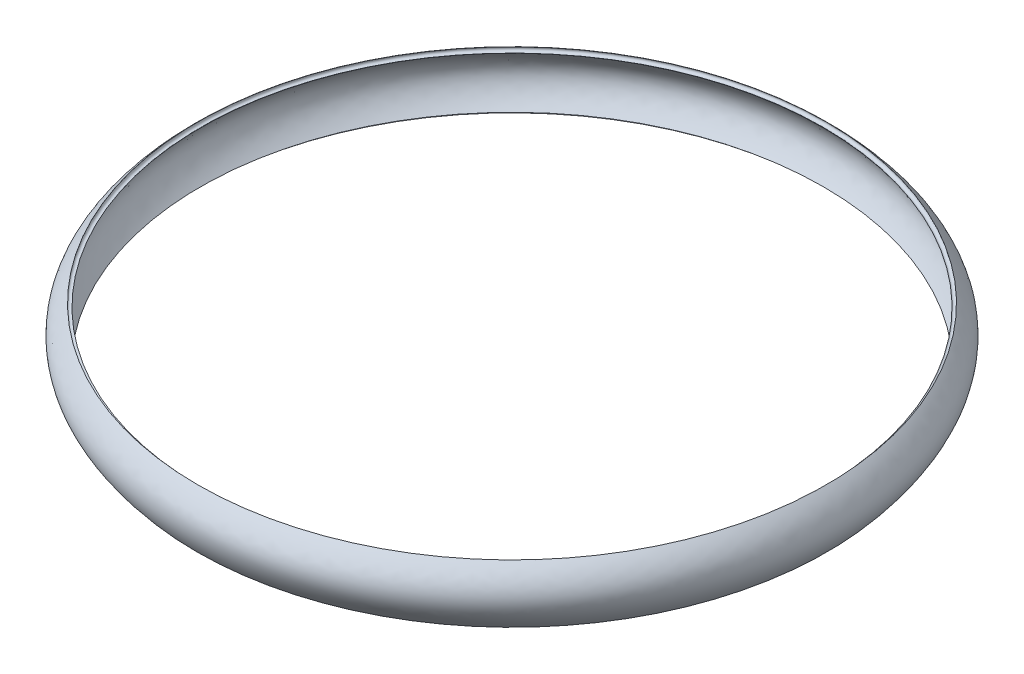
ISO-10303-21;
HEADER;
FILE_DESCRIPTION(('STEP AP214'),'2;1');
FILE_NAME('part.step','',(''),(''),'','','');
FILE_SCHEMA(('AUTOMOTIVE_DESIGN { 1 0 10303 214 1 1 1 1 }'));
ENDSEC;
DATA;
#1=APPLICATION_CONTEXT('core data for automotive mechanical design processes');
#2=APPLICATION_PROTOCOL_DEFINITION('international standard','automotive_design',2000,#1);
#3=PRODUCT_CONTEXT('',#1,'mechanical');
#4=PRODUCT('Part','Part','',(#3));
#5=PRODUCT_RELATED_PRODUCT_CATEGORY('part','',(#4));
#6=PRODUCT_DEFINITION_FORMATION('','',#4);
#7=PRODUCT_DEFINITION_CONTEXT('part definition',#1,'design');
#8=PRODUCT_DEFINITION('design','',#6,#7);
#9=PRODUCT_DEFINITION_SHAPE('','',#8);
#10=(LENGTH_UNIT() NAMED_UNIT(*) SI_UNIT(.MILLI.,.METRE.));
#11=(NAMED_UNIT(*) PLANE_ANGLE_UNIT() SI_UNIT($,.RADIAN.));
#12=(NAMED_UNIT(*) SI_UNIT($,.STERADIAN.) SOLID_ANGLE_UNIT());
#13=UNCERTAINTY_MEASURE_WITH_UNIT(LENGTH_MEASURE(1.E-05),#10,'distance_accuracy_value','');
#14=(GEOMETRIC_REPRESENTATION_CONTEXT(3) GLOBAL_UNCERTAINTY_ASSIGNED_CONTEXT((#13)) GLOBAL_UNIT_ASSIGNED_CONTEXT((#10,
#11,#12)) REPRESENTATION_CONTEXT('',''));
#15=CARTESIAN_POINT('',(0.,0.,0.));
#16=DIRECTION('',(0.,0.,1.));
#17=DIRECTION('',(1.,0.,0.));
#18=AXIS2_PLACEMENT_3D('',#15,#16,#17);
#19=CARTESIAN_POINT('',(-67.7244696988296,6.27572024929824,0.));
#20=CARTESIAN_POINT('',(-72.2899541136645,2.0715681014414,0.));
#21=CARTESIAN_POINT('',(-71.8510066466207,-1.5246225822707,0.));
#22=CARTESIAN_POINT('',(-67.8772066394974,-6.18864013957987,0.));
#23=B_SPLINE_CURVE_WITH_KNOTS('',3,(#19,#20,#21,#22),.UNSPECIFIED.,.F.,.F.,(4,4),(0.,
0.748103808456482),.UNSPECIFIED.);
#24=CARTESIAN_POINT('',(0.,3.29245560536942,0.));
#25=DIRECTION('',(0.,1.,0.));
#26=AXIS1_PLACEMENT('',#24,#25);
#27=SURFACE_OF_REVOLUTION('',#23,#26);
#28=CARTESIAN_POINT('',(0.,-6.18864013957985,0.));
#29=DIRECTION('',(0.,1.,0.));
#30=DIRECTION('',(0.,0.,1.));
#31=AXIS2_PLACEMENT_3D('',#28,#29,#30);
#32=CIRCLE('',#31,67.8772066394974);
#33=CARTESIAN_POINT('',(0.,-6.18864013957985,67.8772066394974));
#34=VERTEX_POINT('',#33);
#35=EDGE_CURVE('E59',#34,#34,#32,.T.);
#36=ORIENTED_EDGE('',*,*,#35,.T.);
#37=EDGE_LOOP('',(#36));
#38=FACE_BOUND('',#37,.T.);
#39=CARTESIAN_POINT('',(0.,6.27572024929824,0.));
#40=DIRECTION('',(0.,1.,0.));
#41=DIRECTION('',(0.,0.,1.));
#42=AXIS2_PLACEMENT_3D('',#39,#40,#41);
#43=CIRCLE('',#42,67.7244696988296);
#44=CARTESIAN_POINT('',(0.,6.27572024929824,67.7244696988296));
#45=VERTEX_POINT('',#44);
#46=EDGE_CURVE('E10',#45,#45,#43,.T.);
#47=ORIENTED_EDGE('',*,*,#46,.F.);
#48=EDGE_LOOP('',(#47));
#49=FACE_BOUND('',#48,.T.);
#50=ADVANCED_FACE('F41',(#38,#49),#27,.F.);
#51=CARTESIAN_POINT('',(0.,5.90791159638101,0.));
#52=DIRECTION('',(0.,1.,0.));
#53=DIRECTION('',(0.,0.,1.));
#54=AXIS2_PLACEMENT_3D('',#51,#52,#53);
#55=TOROIDAL_SURFACE('',#54,67.3857710202977,0.500000000000001);
#56=ORIENTED_EDGE('',*,*,#46,.T.);
#57=EDGE_LOOP('',(#56));
#58=FACE_BOUND('',#57,.T.);
#59=CARTESIAN_POINT('',(0.,5.54010294346378,0.));
#60=DIRECTION('',(0.,1.,0.));
#61=DIRECTION('',(0.,0.,1.));
#62=AXIS2_PLACEMENT_3D('',#59,#60,#61);
#63=CIRCLE('',#62,67.0470723417659);
#64=CARTESIAN_POINT('',(0.,5.54010294346378,67.0470723417659));
#65=VERTEX_POINT('',#64);
#66=EDGE_CURVE('E49',#65,#65,#63,.T.);
#67=ORIENTED_EDGE('',*,*,#66,.F.);
#68=EDGE_LOOP('',(#67));
#69=FACE_BOUND('',#68,.T.);
#70=ADVANCED_FACE('F79',(#58,#69),#55,.F.);
#71=CARTESIAN_POINT('',(-67.1160236751229,-5.5401029434638,0.));
#72=CARTESIAN_POINT('',(-67.3468690698943,-5.26916153415586,0.));
#73=CARTESIAN_POINT('',(-67.8096781991103,-4.70272144393342,0.));
#74=CARTESIAN_POINT('',(-68.5853619917671,-3.64876676821466,0.));
#75=CARTESIAN_POINT('',(-69.3390610640657,-2.39637862833185,0.));
#76=CARTESIAN_POINT('',(-69.8719608440068,-1.02285798040066,0.));
#77=CARTESIAN_POINT('',(-70.0576583838944,0.241647071314583,0.));
#78=CARTESIAN_POINT('',(-69.9167770917393,1.45911451978979,0.));
#79=CARTESIAN_POINT('',(-69.4236653077538,2.72027524226605,0.));
#80=CARTESIAN_POINT('',(-68.6574984156332,3.85261006833536,0.));
#81=CARTESIAN_POINT('',(-67.8244818648536,4.79452460733611,0.));
#82=CARTESIAN_POINT('',(-67.3050871087364,5.3025085858501,0.));
#83=CARTESIAN_POINT('',(-67.0470723417659,5.54010294346378,0.));
#84=B_SPLINE_CURVE_WITH_KNOTS('',3,(#71,#72,#73,#74,#75,#76,#77,#78,#79,#80,#81,#82,#83),
.UNSPECIFIED.,.F.,.F.,(4,1,1,1,1,1,1,1,1,1,4),(0.,0.0467564880285301,0.0935129760570602,
0.18702595211412,0.280538928171181,0.374051904228241,0.467564880285301,0.561077856342362,
0.654590832399422,0.701347320427952,0.748103808456482),.UNSPECIFIED.);
#85=CARTESIAN_POINT('',(0.,3.29245560536942,0.));
#86=DIRECTION('',(0.,1.,0.));
#87=AXIS1_PLACEMENT('',#85,#86);
#88=SURFACE_OF_REVOLUTION('',#84,#87);
#89=ORIENTED_EDGE('',*,*,#66,.T.);
#90=EDGE_LOOP('',(#89));
#91=FACE_BOUND('',#90,.T.);
#92=CARTESIAN_POINT('',(0.,-5.5401029434638,0.));
#93=DIRECTION('',(0.,1.,0.));
#94=DIRECTION('',(0.,0.,1.));
#95=AXIS2_PLACEMENT_3D('',#92,#93,#94);
#96=CIRCLE('',#95,67.1160236751229);
#97=CARTESIAN_POINT('',(0.,-5.5401029434638,67.1160236751229));
#98=VERTEX_POINT('',#97);
#99=EDGE_CURVE('E54',#98,#98,#96,.T.);
#100=ORIENTED_EDGE('',*,*,#99,.F.);
#101=EDGE_LOOP('',(#100));
#102=FACE_BOUND('',#101,.T.);
#103=ADVANCED_FACE('F75',(#91,#102),#88,.F.);
#104=CARTESIAN_POINT('',(0.,-5.86437154152183,0.));
#105=DIRECTION('',(0.,1.,0.));
#106=DIRECTION('',(0.,0.,1.));
#107=AXIS2_PLACEMENT_3D('',#104,#105,#106);
#108=TOROIDAL_SURFACE('',#107,67.4966151573101,0.499999999999998);
#109=ORIENTED_EDGE('',*,*,#99,.T.);
#110=EDGE_LOOP('',(#109));
#111=FACE_BOUND('',#110,.T.);
#112=ORIENTED_EDGE('',*,*,#35,.F.);
#113=EDGE_LOOP('',(#112));
#114=FACE_BOUND('',#113,.T.);
#115=ADVANCED_FACE('F78',(#111,#114),#108,.F.);
#116=CLOSED_SHELL('',(#50,#70,#103,#115));
#117=MANIFOLD_SOLID_BREP('B2',#116);
#118=ADVANCED_BREP_SHAPE_REPRESENTATION('',(#18,#117),#14);
#119=SHAPE_DEFINITION_REPRESENTATION(#9,#118);
ENDSEC;
END-ISO-10303-21;
